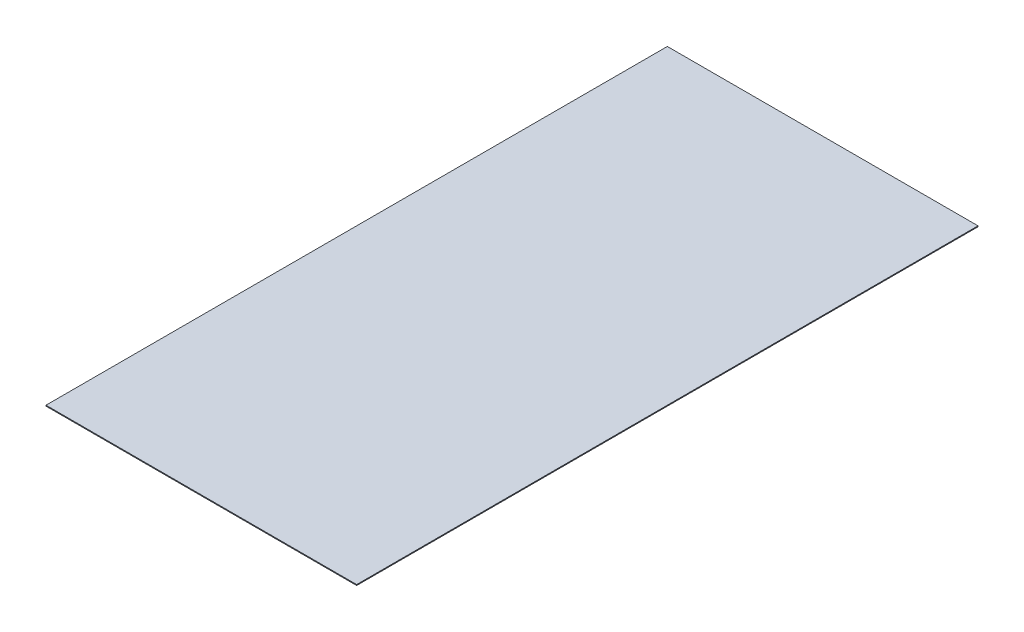
ISO-10303-21;
HEADER;
FILE_DESCRIPTION(('STEP AP214'),'2;1');
FILE_NAME('part.step','',(''),(''),'','','');
FILE_SCHEMA(('AUTOMOTIVE_DESIGN { 1 0 10303 214 1 1 1 1 }'));
ENDSEC;
DATA;
#1=APPLICATION_CONTEXT('core data for automotive mechanical design processes');
#2=APPLICATION_PROTOCOL_DEFINITION('international standard','automotive_design',2000,#1);
#3=PRODUCT_CONTEXT('',#1,'mechanical');
#4=PRODUCT('Part','Part','',(#3));
#5=PRODUCT_RELATED_PRODUCT_CATEGORY('part','',(#4));
#6=PRODUCT_DEFINITION_FORMATION('','',#4);
#7=PRODUCT_DEFINITION_CONTEXT('part definition',#1,'design');
#8=PRODUCT_DEFINITION('design','',#6,#7);
#9=PRODUCT_DEFINITION_SHAPE('','',#8);
#10=(LENGTH_UNIT() NAMED_UNIT(*) SI_UNIT(.MILLI.,.METRE.));
#11=(NAMED_UNIT(*) PLANE_ANGLE_UNIT() SI_UNIT($,.RADIAN.));
#12=(NAMED_UNIT(*) SI_UNIT($,.STERADIAN.) SOLID_ANGLE_UNIT());
#13=UNCERTAINTY_MEASURE_WITH_UNIT(LENGTH_MEASURE(1.E-05),#10,'distance_accuracy_value','');
#14=(GEOMETRIC_REPRESENTATION_CONTEXT(3) GLOBAL_UNCERTAINTY_ASSIGNED_CONTEXT((#13)) GLOBAL_UNIT_ASSIGNED_CONTEXT((#10,
#11,#12)) REPRESENTATION_CONTEXT('',''));
#15=CARTESIAN_POINT('',(0.,0.,0.));
#16=DIRECTION('',(0.,0.,1.));
#17=DIRECTION('',(1.,0.,0.));
#18=AXIS2_PLACEMENT_3D('',#15,#16,#17);
#19=CARTESIAN_POINT('',(609.6,3.4,1219.2));
#20=DIRECTION('',(-1.,0.,0.));
#21=DIRECTION('',(0.,0.,1.));
#22=AXIS2_PLACEMENT_3D('',#19,#20,#21);
#23=PLANE('',#22);
#24=DIRECTION('',(0.,0.,-1.));
#25=VECTOR('',#24,1.);
#26=CARTESIAN_POINT('',(609.6,0.,1219.2));
#27=LINE('',#26,#25);
#28=CARTESIAN_POINT('',(609.6,0.,1219.2));
#29=VERTEX_POINT('',#28);
#30=CARTESIAN_POINT('',(609.6,0.,-1219.2));
#31=VERTEX_POINT('',#30);
#32=EDGE_CURVE('E96',#29,#31,#27,.T.);
#33=ORIENTED_EDGE('',*,*,#32,.T.);
#34=DIRECTION('',(0.,-1.,0.));
#35=VECTOR('',#34,1.);
#36=CARTESIAN_POINT('',(609.6,3.4,-1219.2));
#37=LINE('',#36,#35);
#38=CARTESIAN_POINT('',(609.6,3.4,-1219.2));
#39=VERTEX_POINT('',#38);
#40=EDGE_CURVE('E11',#39,#31,#37,.T.);
#41=ORIENTED_EDGE('',*,*,#40,.F.);
#42=DIRECTION('',(0.,0.,-1.));
#43=VECTOR('',#42,1.);
#44=CARTESIAN_POINT('',(609.6,3.4,1219.2));
#45=LINE('',#44,#43);
#46=CARTESIAN_POINT('',(609.6,3.4,1219.2));
#47=VERTEX_POINT('',#46);
#48=EDGE_CURVE('E84',#47,#39,#45,.T.);
#49=ORIENTED_EDGE('',*,*,#48,.F.);
#50=DIRECTION('',(0.,-1.,0.));
#51=VECTOR('',#50,1.);
#52=CARTESIAN_POINT('',(609.6,3.4,1219.2));
#53=LINE('',#52,#51);
#54=EDGE_CURVE('E92',#47,#29,#53,.T.);
#55=ORIENTED_EDGE('',*,*,#54,.T.);
#56=EDGE_LOOP('',(#33,#41,#49,#55));
#57=FACE_BOUND('',#56,.T.);
#58=ADVANCED_FACE('F33',(#57),#23,.F.);
#59=CARTESIAN_POINT('',(-609.6,3.4,-1219.2));
#60=DIRECTION('',(0.,0.,1.));
#61=DIRECTION('',(1.,0.,0.));
#62=AXIS2_PLACEMENT_3D('',#59,#60,#61);
#63=PLANE('',#62);
#64=DIRECTION('',(-1.,0.,0.));
#65=VECTOR('',#64,1.);
#66=CARTESIAN_POINT('',(-609.6,0.,-1219.2));
#67=LINE('',#66,#65);
#68=CARTESIAN_POINT('',(-609.6,0.,-1219.2));
#69=VERTEX_POINT('',#68);
#70=EDGE_CURVE('E88',#31,#69,#67,.T.);
#71=ORIENTED_EDGE('',*,*,#70,.T.);
#72=DIRECTION('',(0.,-1.,0.));
#73=VECTOR('',#72,1.);
#74=CARTESIAN_POINT('',(-609.6,3.4,-1219.2));
#75=LINE('',#74,#73);
#76=CARTESIAN_POINT('',(-609.6,3.4,-1219.2));
#77=VERTEX_POINT('',#76);
#78=EDGE_CURVE('E41',#77,#69,#75,.T.);
#79=ORIENTED_EDGE('',*,*,#78,.F.);
#80=DIRECTION('',(-1.,0.,0.));
#81=VECTOR('',#80,1.);
#82=CARTESIAN_POINT('',(-609.6,3.4,-1219.2));
#83=LINE('',#82,#81);
#84=EDGE_CURVE('E79',#39,#77,#83,.T.);
#85=ORIENTED_EDGE('',*,*,#84,.F.);
#86=ORIENTED_EDGE('',*,*,#40,.T.);
#87=EDGE_LOOP('',(#71,#79,#85,#86));
#88=FACE_BOUND('',#87,.T.);
#89=ADVANCED_FACE('F87',(#88),#63,.F.);
#90=CARTESIAN_POINT('',(-609.6,3.4,1219.2));
#91=DIRECTION('',(1.,0.,0.));
#92=DIRECTION('',(0.,0.,-1.));
#93=AXIS2_PLACEMENT_3D('',#90,#91,#92);
#94=PLANE('',#93);
#95=DIRECTION('',(0.,0.,1.));
#96=VECTOR('',#95,1.);
#97=CARTESIAN_POINT('',(-609.6,0.,1219.2));
#98=LINE('',#97,#96);
#99=CARTESIAN_POINT('',(-609.6,0.,1219.2));
#100=VERTEX_POINT('',#99);
#101=EDGE_CURVE('E66',#69,#100,#98,.T.);
#102=ORIENTED_EDGE('',*,*,#101,.T.);
#103=DIRECTION('',(0.,-1.,0.));
#104=VECTOR('',#103,1.);
#105=CARTESIAN_POINT('',(-609.6,3.4,1219.2));
#106=LINE('',#105,#104);
#107=CARTESIAN_POINT('',(-609.6,3.4,1219.2));
#108=VERTEX_POINT('',#107);
#109=EDGE_CURVE('E89',#108,#100,#106,.T.);
#110=ORIENTED_EDGE('',*,*,#109,.F.);
#111=DIRECTION('',(0.,0.,1.));
#112=VECTOR('',#111,1.);
#113=CARTESIAN_POINT('',(-609.6,3.4,1219.2));
#114=LINE('',#113,#112);
#115=EDGE_CURVE('E82',#77,#108,#114,.T.);
#116=ORIENTED_EDGE('',*,*,#115,.F.);
#117=ORIENTED_EDGE('',*,*,#78,.T.);
#118=EDGE_LOOP('',(#102,#110,#116,#117));
#119=FACE_BOUND('',#118,.T.);
#120=ADVANCED_FACE('F90',(#119),#94,.F.);
#121=CARTESIAN_POINT('',(-609.6,3.4,1219.2));
#122=DIRECTION('',(0.,0.,-1.));
#123=DIRECTION('',(-1.,0.,0.));
#124=AXIS2_PLACEMENT_3D('',#121,#122,#123);
#125=PLANE('',#124);
#126=DIRECTION('',(1.,0.,0.));
#127=VECTOR('',#126,1.);
#128=CARTESIAN_POINT('',(-609.6,0.,1219.2));
#129=LINE('',#128,#127);
#130=EDGE_CURVE('E72',#100,#29,#129,.T.);
#131=ORIENTED_EDGE('',*,*,#130,.T.);
#132=ORIENTED_EDGE('',*,*,#54,.F.);
#133=DIRECTION('',(1.,0.,0.));
#134=VECTOR('',#133,1.);
#135=CARTESIAN_POINT('',(-609.6,3.4,1219.2));
#136=LINE('',#135,#134);
#137=EDGE_CURVE('E49',#108,#47,#136,.T.);
#138=ORIENTED_EDGE('',*,*,#137,.F.);
#139=ORIENTED_EDGE('',*,*,#109,.T.);
#140=EDGE_LOOP('',(#131,#132,#138,#139));
#141=FACE_BOUND('',#140,.T.);
#142=ADVANCED_FACE('F103',(#141),#125,.F.);
#143=CARTESIAN_POINT('',(0.,3.4,0.));
#144=DIRECTION('',(0.,-1.,0.));
#145=DIRECTION('',(0.,0.,-1.));
#146=AXIS2_PLACEMENT_3D('',#143,#144,#145);
#147=PLANE('',#146);
#148=ORIENTED_EDGE('',*,*,#48,.T.);
#149=ORIENTED_EDGE('',*,*,#84,.T.);
#150=ORIENTED_EDGE('',*,*,#115,.T.);
#151=ORIENTED_EDGE('',*,*,#137,.T.);
#152=EDGE_LOOP('',(#148,#149,#150,#151));
#153=FACE_BOUND('',#152,.T.);
#154=ADVANCED_FACE('F80',(#153),#147,.F.);
#155=CARTESIAN_POINT('',(0.,0.,0.));
#156=DIRECTION('',(0.,-1.,0.));
#157=DIRECTION('',(0.,0.,-1.));
#158=AXIS2_PLACEMENT_3D('',#155,#156,#157);
#159=PLANE('',#158);
#160=ORIENTED_EDGE('',*,*,#32,.F.);
#161=ORIENTED_EDGE('',*,*,#130,.F.);
#162=ORIENTED_EDGE('',*,*,#101,.F.);
#163=ORIENTED_EDGE('',*,*,#70,.F.);
#164=EDGE_LOOP('',(#160,#161,#162,#163));
#165=FACE_BOUND('',#164,.T.);
#166=ADVANCED_FACE('F106',(#165),#159,.T.);
#167=CLOSED_SHELL('',(#58,#89,#120,#142,#154,#166));
#168=MANIFOLD_SOLID_BREP('B2',#167);
#169=ADVANCED_BREP_SHAPE_REPRESENTATION('',(#18,#168),#14);
#170=SHAPE_DEFINITION_REPRESENTATION(#9,#169);
ENDSEC;
END-ISO-10303-21;
